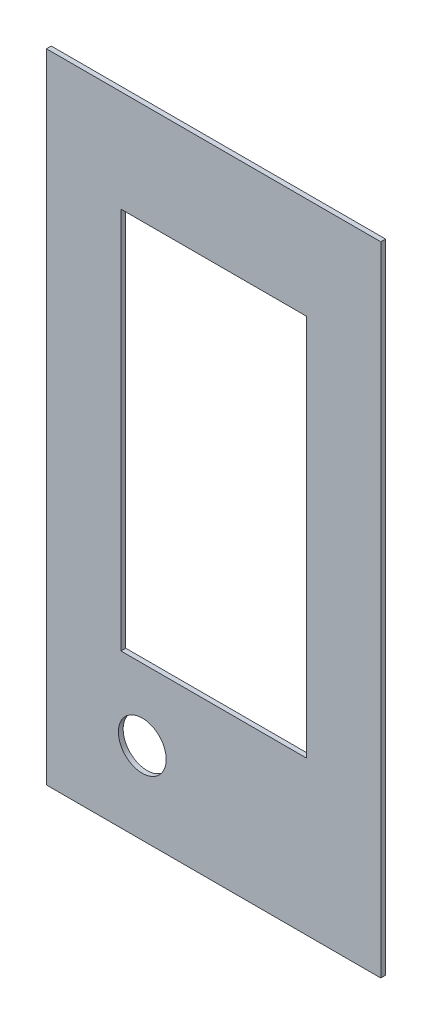
ISO-10303-21;
HEADER;
FILE_DESCRIPTION(('STEP AP214'),'2;1');
FILE_NAME('part.step','',(''),(''),'','','');
FILE_SCHEMA(('AUTOMOTIVE_DESIGN { 1 0 10303 214 1 1 1 1 }'));
ENDSEC;
DATA;
#1=APPLICATION_CONTEXT('core data for automotive mechanical design processes');
#2=APPLICATION_PROTOCOL_DEFINITION('international standard','automotive_design',2000,#1);
#3=PRODUCT_CONTEXT('',#1,'mechanical');
#4=PRODUCT('Part','Part','',(#3));
#5=PRODUCT_RELATED_PRODUCT_CATEGORY('part','',(#4));
#6=PRODUCT_DEFINITION_FORMATION('','',#4);
#7=PRODUCT_DEFINITION_CONTEXT('part definition',#1,'design');
#8=PRODUCT_DEFINITION('design','',#6,#7);
#9=PRODUCT_DEFINITION_SHAPE('','',#8);
#10=(LENGTH_UNIT() NAMED_UNIT(*) SI_UNIT(.MILLI.,.METRE.));
#11=(NAMED_UNIT(*) PLANE_ANGLE_UNIT() SI_UNIT($,.RADIAN.));
#12=(NAMED_UNIT(*) SI_UNIT($,.STERADIAN.) SOLID_ANGLE_UNIT());
#13=UNCERTAINTY_MEASURE_WITH_UNIT(LENGTH_MEASURE(1.E-05),#10,'distance_accuracy_value','');
#14=(GEOMETRIC_REPRESENTATION_CONTEXT(3) GLOBAL_UNCERTAINTY_ASSIGNED_CONTEXT((#13)) GLOBAL_UNIT_ASSIGNED_CONTEXT((#10,
#11,#12)) REPRESENTATION_CONTEXT('',''));
#15=CARTESIAN_POINT('',(0.,0.,0.));
#16=DIRECTION('',(0.,0.,1.));
#17=DIRECTION('',(1.,0.,0.));
#18=AXIS2_PLACEMENT_3D('',#15,#16,#17);
#19=CARTESIAN_POINT('',(-144.788214556006,812.818814105007,5.34139210268123));
#20=DIRECTION('',(0.,0.,-1.));
#21=DIRECTION('',(-1.,0.,0.));
#22=AXIS2_PLACEMENT_3D('',#19,#20,#21);
#23=PLANE('',#22);
#24=DIRECTION('',(1.,0.,0.));
#25=VECTOR('',#24,1.);
#26=CARTESIAN_POINT('',(-144.788214556006,533.213673316679,5.34139210268123));
#27=LINE('',#26,#25);
#28=CARTESIAN_POINT('',(-144.788214556006,533.213673316679,5.34139210268123));
#29=VERTEX_POINT('',#28);
#30=CARTESIAN_POINT('',(134.788312991033,533.213673316679,5.34139210268123));
#31=VERTEX_POINT('',#30);
#32=EDGE_CURVE('E42',#29,#31,#27,.T.);
#33=ORIENTED_EDGE('',*,*,#32,.F.);
#34=DIRECTION('',(0.,-1.,0.));
#35=VECTOR('',#34,1.);
#36=CARTESIAN_POINT('',(-144.788214556006,812.818814105007,5.34139210268123));
#37=LINE('',#36,#35);
#38=CARTESIAN_POINT('',(-144.788214556006,0.,5.34139210268123));
#39=VERTEX_POINT('',#38);
#40=EDGE_CURVE('E152',#29,#39,#37,.T.);
#41=ORIENTED_EDGE('',*,*,#40,.T.);
#42=DIRECTION('',(1.,0.,0.));
#43=VECTOR('',#42,1.);
#44=CARTESIAN_POINT('',(-144.788214556006,0.,5.34139210268123));
#45=LINE('',#44,#43);
#46=CARTESIAN_POINT('',(134.788312991033,0.,5.34139210268123));
#47=VERTEX_POINT('',#46);
#48=EDGE_CURVE('E149',#39,#47,#45,.T.);
#49=ORIENTED_EDGE('',*,*,#48,.T.);
#50=DIRECTION('',(0.,-1.,0.));
#51=VECTOR('',#50,1.);
#52=CARTESIAN_POINT('',(134.788312991033,812.818814105007,5.34139210268123));
#53=LINE('',#52,#51);
#54=EDGE_CURVE('E148',#31,#47,#53,.T.);
#55=ORIENTED_EDGE('',*,*,#54,.F.);
#56=EDGE_LOOP('',(#33,#41,#49,#55));
#57=FACE_BOUND('',#56,.T.);
#58=CARTESIAN_POINT('',(-64.6515662859288,68.5541508913983,5.34139210268123));
#59=DIRECTION('',(0.,0.,-1.));
#60=DIRECTION('',(-1.,0.,0.));
#61=AXIS2_PLACEMENT_3D('',#58,#59,#60);
#62=CIRCLE('',#61,20.);
#63=CARTESIAN_POINT('',(-84.6515662859288,68.5541508913983,5.34139210268123));
#64=VERTEX_POINT('',#63);
#65=EDGE_CURVE('E135',#64,#64,#62,.T.);
#66=ORIENTED_EDGE('',*,*,#65,.T.);
#67=EDGE_LOOP('',(#66));
#68=FACE_BOUND('',#67,.T.);
#69=DIRECTION('',(-1.,0.,0.));
#70=VECTOR('',#69,1.);
#71=CARTESIAN_POINT('',(72.5000492175112,448.213673316679,5.34139210268123));
#72=LINE('',#71,#70);
#73=CARTESIAN_POINT('',(72.5000492175112,448.213673316679,5.34139210268123));
#74=VERTEX_POINT('',#73);
#75=CARTESIAN_POINT('',(-82.4999507824888,448.213673316679,5.34139210268123));
#76=VERTEX_POINT('',#75);
#77=EDGE_CURVE('E100',#74,#76,#72,.T.);
#78=ORIENTED_EDGE('',*,*,#77,.F.);
#79=DIRECTION('',(0.,-1.,0.));
#80=VECTOR('',#79,1.);
#81=CARTESIAN_POINT('',(72.5000492175112,448.213673316679,5.34139210268123));
#82=LINE('',#81,#80);
#83=CARTESIAN_POINT('',(72.5000492175112,128.213673316679,5.34139210268123));
#84=VERTEX_POINT('',#83);
#85=EDGE_CURVE('E120',#74,#84,#82,.T.);
#86=ORIENTED_EDGE('',*,*,#85,.T.);
#87=DIRECTION('',(-1.,0.,0.));
#88=VECTOR('',#87,1.);
#89=CARTESIAN_POINT('',(72.5000492175112,128.213673316679,5.34139210268123));
#90=LINE('',#89,#88);
#91=CARTESIAN_POINT('',(-82.4999507824888,128.213673316679,5.34139210268123));
#92=VERTEX_POINT('',#91);
#93=EDGE_CURVE('E50',#84,#92,#90,.T.);
#94=ORIENTED_EDGE('',*,*,#93,.T.);
#95=DIRECTION('',(0.,-1.,0.));
#96=VECTOR('',#95,1.);
#97=CARTESIAN_POINT('',(-82.4999507824888,448.213673316679,5.34139210268123));
#98=LINE('',#97,#96);
#99=EDGE_CURVE('E109',#76,#92,#98,.T.);
#100=ORIENTED_EDGE('',*,*,#99,.F.);
#101=EDGE_LOOP('',(#78,#86,#94,#100));
#102=FACE_BOUND('',#101,.T.);
#103=ADVANCED_FACE('F33',(#57,#68,#102),#23,.F.);
#104=CARTESIAN_POINT('',(-144.788214556006,812.818814105007,1.34139210268123));
#105=DIRECTION('',(0.,0.,1.));
#106=DIRECTION('',(1.,0.,0.));
#107=AXIS2_PLACEMENT_3D('',#104,#105,#106);
#108=PLANE('',#107);
#109=DIRECTION('',(-1.,0.,0.));
#110=VECTOR('',#109,1.);
#111=CARTESIAN_POINT('',(-144.788214556006,533.213673316679,1.34139210268123));
#112=LINE('',#111,#110);
#113=CARTESIAN_POINT('',(134.788312991033,533.213673316679,1.34139210268123));
#114=VERTEX_POINT('',#113);
#115=CARTESIAN_POINT('',(-144.788214556006,533.213673316679,1.34139210268123));
#116=VERTEX_POINT('',#115);
#117=EDGE_CURVE('E143',#114,#116,#112,.T.);
#118=ORIENTED_EDGE('',*,*,#117,.F.);
#119=DIRECTION('',(0.,-1.,0.));
#120=VECTOR('',#119,1.);
#121=CARTESIAN_POINT('',(134.788312991033,812.818814105007,1.34139210268123));
#122=LINE('',#121,#120);
#123=CARTESIAN_POINT('',(134.788312991033,0.,1.34139210268123));
#124=VERTEX_POINT('',#123);
#125=EDGE_CURVE('E144',#114,#124,#122,.T.);
#126=ORIENTED_EDGE('',*,*,#125,.T.);
#127=DIRECTION('',(-1.,0.,0.));
#128=VECTOR('',#127,1.);
#129=CARTESIAN_POINT('',(-144.788214556006,0.,1.34139210268123));
#130=LINE('',#129,#128);
#131=CARTESIAN_POINT('',(-144.788214556006,0.,1.34139210268123));
#132=VERTEX_POINT('',#131);
#133=EDGE_CURVE('E140',#124,#132,#130,.T.);
#134=ORIENTED_EDGE('',*,*,#133,.T.);
#135=DIRECTION('',(0.,-1.,0.));
#136=VECTOR('',#135,1.);
#137=CARTESIAN_POINT('',(-144.788214556006,812.818814105007,1.34139210268123));
#138=LINE('',#137,#136);
#139=EDGE_CURVE('E37',#116,#132,#138,.T.);
#140=ORIENTED_EDGE('',*,*,#139,.F.);
#141=EDGE_LOOP('',(#118,#126,#134,#140));
#142=FACE_BOUND('',#141,.T.);
#143=CARTESIAN_POINT('',(-64.6515662859288,68.5541508913983,1.34139210268123));
#144=DIRECTION('',(0.,0.,-1.));
#145=DIRECTION('',(-1.,0.,0.));
#146=AXIS2_PLACEMENT_3D('',#143,#144,#145);
#147=CIRCLE('',#146,20.);
#148=CARTESIAN_POINT('',(-84.6515662859288,68.5541508913983,1.34139210268123));
#149=VERTEX_POINT('',#148);
#150=EDGE_CURVE('E116',#149,#149,#147,.T.);
#151=ORIENTED_EDGE('',*,*,#150,.F.);
#152=EDGE_LOOP('',(#151));
#153=FACE_BOUND('',#152,.T.);
#154=DIRECTION('',(-1.,0.,0.));
#155=VECTOR('',#154,1.);
#156=CARTESIAN_POINT('',(72.5000492175112,448.213673316679,1.34139210268123));
#157=LINE('',#156,#155);
#158=CARTESIAN_POINT('',(72.5000492175112,448.213673316679,1.34139210268123));
#159=VERTEX_POINT('',#158);
#160=CARTESIAN_POINT('',(-82.4999507824888,448.213673316679,1.34139210268123));
#161=VERTEX_POINT('',#160);
#162=EDGE_CURVE('E58',#159,#161,#157,.T.);
#163=ORIENTED_EDGE('',*,*,#162,.T.);
#164=DIRECTION('',(0.,-1.,0.));
#165=VECTOR('',#164,1.);
#166=CARTESIAN_POINT('',(-82.4999507824888,448.213673316679,1.34139210268123));
#167=LINE('',#166,#165);
#168=CARTESIAN_POINT('',(-82.4999507824888,128.213673316679,1.34139210268123));
#169=VERTEX_POINT('',#168);
#170=EDGE_CURVE('E115',#161,#169,#167,.T.);
#171=ORIENTED_EDGE('',*,*,#170,.T.);
#172=DIRECTION('',(-1.,0.,0.));
#173=VECTOR('',#172,1.);
#174=CARTESIAN_POINT('',(72.5000492175112,128.213673316679,1.34139210268123));
#175=LINE('',#174,#173);
#176=CARTESIAN_POINT('',(72.5000492175112,128.213673316679,1.34139210268123));
#177=VERTEX_POINT('',#176);
#178=EDGE_CURVE('E126',#177,#169,#175,.T.);
#179=ORIENTED_EDGE('',*,*,#178,.F.);
#180=DIRECTION('',(0.,-1.,0.));
#181=VECTOR('',#180,1.);
#182=CARTESIAN_POINT('',(72.5000492175112,448.213673316679,1.34139210268123));
#183=LINE('',#182,#181);
#184=EDGE_CURVE('E110',#159,#177,#183,.T.);
#185=ORIENTED_EDGE('',*,*,#184,.F.);
#186=EDGE_LOOP('',(#163,#171,#179,#185));
#187=FACE_BOUND('',#186,.T.);
#188=ADVANCED_FACE('F166',(#142,#153,#187),#108,.F.);
#189=CARTESIAN_POINT('',(-144.788214556006,812.818814105007,1.34139210268123));
#190=DIRECTION('',(1.,0.,0.));
#191=DIRECTION('',(0.,0.,-1.));
#192=AXIS2_PLACEMENT_3D('',#189,#190,#191);
#193=PLANE('',#192);
#194=DIRECTION('',(0.,0.,1.));
#195=VECTOR('',#194,1.);
#196=CARTESIAN_POINT('',(-144.788214556006,533.213673316679,1.34139210268118));
#197=LINE('',#196,#195);
#198=EDGE_CURVE('E158',#116,#29,#197,.T.);
#199=ORIENTED_EDGE('',*,*,#198,.F.);
#200=ORIENTED_EDGE('',*,*,#139,.T.);
#201=DIRECTION('',(0.,0.,1.));
#202=VECTOR('',#201,1.);
#203=CARTESIAN_POINT('',(-144.788214556006,0.,1.34139210268123));
#204=LINE('',#203,#202);
#205=EDGE_CURVE('E153',#132,#39,#204,.T.);
#206=ORIENTED_EDGE('',*,*,#205,.T.);
#207=ORIENTED_EDGE('',*,*,#40,.F.);
#208=EDGE_LOOP('',(#199,#200,#206,#207));
#209=FACE_BOUND('',#208,.T.);
#210=ADVANCED_FACE('F180',(#209),#193,.F.);
#211=CARTESIAN_POINT('',(134.788312991033,812.818814105007,1.34139210268123));
#212=DIRECTION('',(-1.,0.,0.));
#213=DIRECTION('',(0.,0.,1.));
#214=AXIS2_PLACEMENT_3D('',#211,#212,#213);
#215=PLANE('',#214);
#216=DIRECTION('',(0.,0.,-1.));
#217=VECTOR('',#216,1.);
#218=CARTESIAN_POINT('',(134.788312991033,533.213673316679,1.34139210268118));
#219=LINE('',#218,#217);
#220=EDGE_CURVE('E11',#31,#114,#219,.T.);
#221=ORIENTED_EDGE('',*,*,#220,.F.);
#222=ORIENTED_EDGE('',*,*,#54,.T.);
#223=DIRECTION('',(0.,0.,-1.));
#224=VECTOR('',#223,1.);
#225=CARTESIAN_POINT('',(134.788312991033,0.,1.34139210268123));
#226=LINE('',#225,#224);
#227=EDGE_CURVE('E145',#47,#124,#226,.T.);
#228=ORIENTED_EDGE('',*,*,#227,.T.);
#229=ORIENTED_EDGE('',*,*,#125,.F.);
#230=EDGE_LOOP('',(#221,#222,#228,#229));
#231=FACE_BOUND('',#230,.T.);
#232=ADVANCED_FACE('F172',(#231),#215,.F.);
#233=CARTESIAN_POINT('',(-144.788214556006,0.,5.34139210268123));
#234=DIRECTION('',(0.,1.,0.));
#235=DIRECTION('',(0.,0.,1.));
#236=AXIS2_PLACEMENT_3D('',#233,#234,#235);
#237=PLANE('',#236);
#238=ORIENTED_EDGE('',*,*,#205,.F.);
#239=ORIENTED_EDGE('',*,*,#133,.F.);
#240=ORIENTED_EDGE('',*,*,#227,.F.);
#241=ORIENTED_EDGE('',*,*,#48,.F.);
#242=EDGE_LOOP('',(#238,#239,#240,#241));
#243=FACE_BOUND('',#242,.T.);
#244=ADVANCED_FACE('F176',(#243),#237,.F.);
#245=CARTESIAN_POINT('',(143.300985445436,533.213673316679,-100.937415098017));
#246=DIRECTION('',(0.,1.,0.));
#247=DIRECTION('',(0.,0.,-1.));
#248=AXIS2_PLACEMENT_3D('',#245,#246,#247);
#249=PLANE('',#248);
#250=ORIENTED_EDGE('',*,*,#117,.T.);
#251=ORIENTED_EDGE('',*,*,#198,.T.);
#252=ORIENTED_EDGE('',*,*,#32,.T.);
#253=ORIENTED_EDGE('',*,*,#220,.T.);
#254=EDGE_LOOP('',(#250,#251,#252,#253));
#255=FACE_BOUND('',#254,.T.);
#256=ADVANCED_FACE('F35',(#255),#249,.T.);
#257=CARTESIAN_POINT('',(-64.6515662859288,68.5541508913983,5.34139210268123));
#258=DIRECTION('',(0.,0.,-1.));
#259=DIRECTION('',(-1.,0.,0.));
#260=AXIS2_PLACEMENT_3D('',#257,#258,#259);
#261=CYLINDRICAL_SURFACE('',#260,20.);
#262=ORIENTED_EDGE('',*,*,#65,.F.);
#263=EDGE_LOOP('',(#262));
#264=FACE_BOUND('',#263,.T.);
#265=ORIENTED_EDGE('',*,*,#150,.T.);
#266=EDGE_LOOP('',(#265));
#267=FACE_BOUND('',#266,.T.);
#268=ADVANCED_FACE('F188',(#264,#267),#261,.F.);
#269=CARTESIAN_POINT('',(72.5000492175112,448.213673316679,5.34139210268123));
#270=DIRECTION('',(0.,-1.,0.));
#271=DIRECTION('',(0.,0.,-1.));
#272=AXIS2_PLACEMENT_3D('',#269,#270,#271);
#273=PLANE('',#272);
#274=ORIENTED_EDGE('',*,*,#162,.F.);
#275=DIRECTION('',(0.,0.,-1.));
#276=VECTOR('',#275,1.);
#277=CARTESIAN_POINT('',(72.5000492175112,448.213673316679,5.34139210268123));
#278=LINE('',#277,#276);
#279=EDGE_CURVE('E104',#74,#159,#278,.T.);
#280=ORIENTED_EDGE('',*,*,#279,.F.);
#281=ORIENTED_EDGE('',*,*,#77,.T.);
#282=DIRECTION('',(0.,0.,-1.));
#283=VECTOR('',#282,1.);
#284=CARTESIAN_POINT('',(-82.4999507824888,448.213673316679,5.34139210268123));
#285=LINE('',#284,#283);
#286=EDGE_CURVE('E103',#76,#161,#285,.T.);
#287=ORIENTED_EDGE('',*,*,#286,.T.);
#288=EDGE_LOOP('',(#274,#280,#281,#287));
#289=FACE_BOUND('',#288,.T.);
#290=ADVANCED_FACE('F102',(#289),#273,.T.);
#291=CARTESIAN_POINT('',(-82.4999507824888,448.213673316679,5.34139210268123));
#292=DIRECTION('',(1.,0.,0.));
#293=DIRECTION('',(0.,0.,-1.));
#294=AXIS2_PLACEMENT_3D('',#291,#292,#293);
#295=PLANE('',#294);
#296=ORIENTED_EDGE('',*,*,#170,.F.);
#297=ORIENTED_EDGE('',*,*,#286,.F.);
#298=ORIENTED_EDGE('',*,*,#99,.T.);
#299=DIRECTION('',(0.,0.,-1.));
#300=VECTOR('',#299,1.);
#301=CARTESIAN_POINT('',(-82.4999507824888,128.213673316679,5.34139210268123));
#302=LINE('',#301,#300);
#303=EDGE_CURVE('E117',#92,#169,#302,.T.);
#304=ORIENTED_EDGE('',*,*,#303,.T.);
#305=EDGE_LOOP('',(#296,#297,#298,#304));
#306=FACE_BOUND('',#305,.T.);
#307=ADVANCED_FACE('F113',(#306),#295,.T.);
#308=CARTESIAN_POINT('',(72.5000492175112,128.213673316679,5.34139210268123));
#309=DIRECTION('',(0.,-1.,0.));
#310=DIRECTION('',(0.,0.,-1.));
#311=AXIS2_PLACEMENT_3D('',#308,#309,#310);
#312=PLANE('',#311);
#313=ORIENTED_EDGE('',*,*,#178,.T.);
#314=ORIENTED_EDGE('',*,*,#303,.F.);
#315=ORIENTED_EDGE('',*,*,#93,.F.);
#316=DIRECTION('',(0.,0.,-1.));
#317=VECTOR('',#316,1.);
#318=CARTESIAN_POINT('',(72.5000492175112,128.213673316679,5.34139210268123));
#319=LINE('',#318,#317);
#320=EDGE_CURVE('E132',#84,#177,#319,.T.);
#321=ORIENTED_EDGE('',*,*,#320,.T.);
#322=EDGE_LOOP('',(#313,#314,#315,#321));
#323=FACE_BOUND('',#322,.T.);
#324=ADVANCED_FACE('F200',(#323),#312,.F.);
#325=CARTESIAN_POINT('',(72.5000492175112,448.213673316679,5.34139210268123));
#326=DIRECTION('',(1.,0.,0.));
#327=DIRECTION('',(0.,1.,0.));
#328=AXIS2_PLACEMENT_3D('',#325,#326,#327);
#329=PLANE('',#328);
#330=ORIENTED_EDGE('',*,*,#184,.T.);
#331=ORIENTED_EDGE('',*,*,#320,.F.);
#332=ORIENTED_EDGE('',*,*,#85,.F.);
#333=ORIENTED_EDGE('',*,*,#279,.T.);
#334=EDGE_LOOP('',(#330,#331,#332,#333));
#335=FACE_BOUND('',#334,.T.);
#336=ADVANCED_FACE('F199',(#335),#329,.F.);
#337=CLOSED_SHELL('',(#103,#188,#210,#232,#244,#256,#268,#290,#307,#324,#336));
#338=MANIFOLD_SOLID_BREP('B2',#337);
#339=ADVANCED_BREP_SHAPE_REPRESENTATION('',(#18,#338),#14);
#340=SHAPE_DEFINITION_REPRESENTATION(#9,#339);
ENDSEC;
END-ISO-10303-21;
